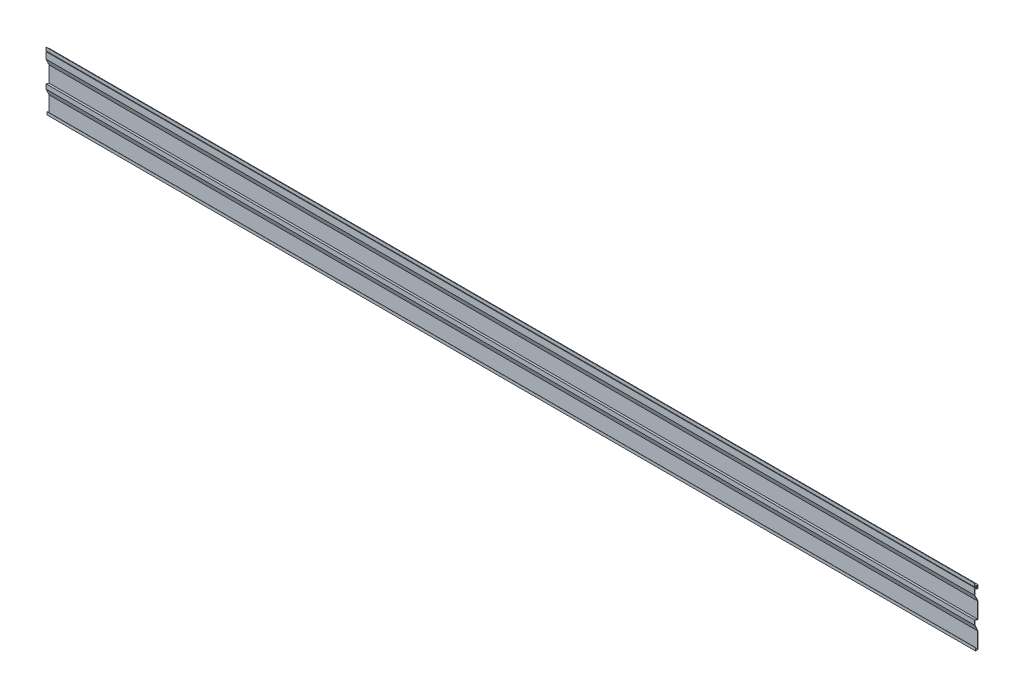
ISO-10303-21;
HEADER;
FILE_DESCRIPTION(('STEP AP214'),'2;1');
FILE_NAME('part.step','',(''),(''),'','','');
FILE_SCHEMA(('AUTOMOTIVE_DESIGN { 1 0 10303 214 1 1 1 1 }'));
ENDSEC;
DATA;
#1=APPLICATION_CONTEXT('core data for automotive mechanical design processes');
#2=APPLICATION_PROTOCOL_DEFINITION('international standard','automotive_design',2000,#1);
#3=PRODUCT_CONTEXT('',#1,'mechanical');
#4=PRODUCT('Part','Part','',(#3));
#5=PRODUCT_RELATED_PRODUCT_CATEGORY('part','',(#4));
#6=PRODUCT_DEFINITION_FORMATION('','',#4);
#7=PRODUCT_DEFINITION_CONTEXT('part definition',#1,'design');
#8=PRODUCT_DEFINITION('design','',#6,#7);
#9=PRODUCT_DEFINITION_SHAPE('','',#8);
#10=(LENGTH_UNIT() NAMED_UNIT(*) SI_UNIT(.MILLI.,.METRE.));
#11=(NAMED_UNIT(*) PLANE_ANGLE_UNIT() SI_UNIT($,.RADIAN.));
#12=(NAMED_UNIT(*) SI_UNIT($,.STERADIAN.) SOLID_ANGLE_UNIT());
#13=UNCERTAINTY_MEASURE_WITH_UNIT(LENGTH_MEASURE(1.E-05),#10,'distance_accuracy_value','');
#14=(GEOMETRIC_REPRESENTATION_CONTEXT(3) GLOBAL_UNCERTAINTY_ASSIGNED_CONTEXT((#13)) GLOBAL_UNIT_ASSIGNED_CONTEXT((#10,
#11,#12)) REPRESENTATION_CONTEXT('',''));
#15=CARTESIAN_POINT('',(0.,0.,0.));
#16=DIRECTION('',(0.,0.,1.));
#17=DIRECTION('',(1.,0.,0.));
#18=AXIS2_PLACEMENT_3D('',#15,#16,#17);
#19=CARTESIAN_POINT('',(3660.,-176.742770169573,21.0404628300535));
#20=DIRECTION('',(0.,0.,-1.));
#21=DIRECTION('',(-1.,0.,0.));
#22=AXIS2_PLACEMENT_3D('',#19,#20,#21);
#23=PLANE('',#22);
#24=DIRECTION('',(0.,-1.,0.));
#25=VECTOR('',#24,1.);
#26=CARTESIAN_POINT('',(0.,-176.742770169573,21.0404628300535));
#27=LINE('',#26,#25);
#28=CARTESIAN_POINT('',(0.,-165.442275203157,21.0404628300535));
#29=VERTEX_POINT('',#28);
#30=CARTESIAN_POINT('',(0.,-176.742770169573,21.0404628300535));
#31=VERTEX_POINT('',#30);
#32=EDGE_CURVE('E278',#29,#31,#27,.T.);
#33=ORIENTED_EDGE('',*,*,#32,.T.);
#34=DIRECTION('',(-1.,0.,0.));
#35=VECTOR('',#34,1.);
#36=CARTESIAN_POINT('',(3660.,-176.742770169573,21.0404628300535));
#37=LINE('',#36,#35);
#38=CARTESIAN_POINT('',(3660.,-176.742770169573,21.0404628300535));
#39=VERTEX_POINT('',#38);
#40=EDGE_CURVE('E11',#39,#31,#37,.T.);
#41=ORIENTED_EDGE('',*,*,#40,.F.);
#42=DIRECTION('',(0.,-1.,0.));
#43=VECTOR('',#42,1.);
#44=CARTESIAN_POINT('',(3660.,-176.742770169573,21.0404628300535));
#45=LINE('',#44,#43);
#46=CARTESIAN_POINT('',(3660.,-165.442275203157,21.0404628300535));
#47=VERTEX_POINT('',#46);
#48=EDGE_CURVE('E340',#47,#39,#45,.T.);
#49=ORIENTED_EDGE('',*,*,#48,.F.);
#50=DIRECTION('',(-1.,0.,0.));
#51=VECTOR('',#50,1.);
#52=CARTESIAN_POINT('',(3660.,-165.442275203157,21.0404628300535));
#53=LINE('',#52,#51);
#54=EDGE_CURVE('E274',#47,#29,#53,.T.);
#55=ORIENTED_EDGE('',*,*,#54,.T.);
#56=EDGE_LOOP('',(#33,#41,#49,#55));
#57=FACE_BOUND('',#56,.T.);
#58=ADVANCED_FACE('F38',(#57),#23,.F.);
#59=CARTESIAN_POINT('',(3660.,-176.742770169573,21.0404628300535));
#60=DIRECTION('',(0.,1.,0.));
#61=DIRECTION('',(0.,0.,1.));
#62=AXIS2_PLACEMENT_3D('',#59,#60,#61);
#63=PLANE('',#62);
#64=DIRECTION('',(0.,0.,-1.));
#65=VECTOR('',#64,1.);
#66=CARTESIAN_POINT('',(0.,-176.742770169573,21.0404628300535));
#67=LINE('',#66,#65);
#68=CARTESIAN_POINT('',(0.,-176.742770169573,11.0404628300535));
#69=VERTEX_POINT('',#68);
#70=EDGE_CURVE('E281',#31,#69,#67,.T.);
#71=ORIENTED_EDGE('',*,*,#70,.T.);
#72=DIRECTION('',(-1.,0.,0.));
#73=VECTOR('',#72,1.);
#74=CARTESIAN_POINT('',(3660.,-176.742770169573,11.0404628300535));
#75=LINE('',#74,#73);
#76=CARTESIAN_POINT('',(3660.,-176.742770169573,11.0404628300535));
#77=VERTEX_POINT('',#76);
#78=EDGE_CURVE('E46',#77,#69,#75,.T.);
#79=ORIENTED_EDGE('',*,*,#78,.F.);
#80=DIRECTION('',(0.,0.,-1.));
#81=VECTOR('',#80,1.);
#82=CARTESIAN_POINT('',(3660.,-176.742770169573,21.0404628300535));
#83=LINE('',#82,#81);
#84=EDGE_CURVE('E169',#39,#77,#83,.T.);
#85=ORIENTED_EDGE('',*,*,#84,.F.);
#86=ORIENTED_EDGE('',*,*,#40,.T.);
#87=EDGE_LOOP('',(#71,#79,#85,#86));
#88=FACE_BOUND('',#87,.T.);
#89=ADVANCED_FACE('F518',(#88),#63,.F.);
#90=CARTESIAN_POINT('',(3660.,-176.742770169573,11.0404628300535));
#91=DIRECTION('',(0.,0.,1.));
#92=DIRECTION('',(1.,0.,0.));
#93=AXIS2_PLACEMENT_3D('',#90,#91,#92);
#94=PLANE('',#93);
#95=DIRECTION('',(0.,1.,0.));
#96=VECTOR('',#95,1.);
#97=CARTESIAN_POINT('',(0.,-176.742770169573,11.0404628300535));
#98=LINE('',#97,#96);
#99=CARTESIAN_POINT('',(0.,-112.742770169573,11.0404628300535));
#100=VERTEX_POINT('',#99);
#101=EDGE_CURVE('E283',#69,#100,#98,.T.);
#102=ORIENTED_EDGE('',*,*,#101,.T.);
#103=DIRECTION('',(-1.,0.,0.));
#104=VECTOR('',#103,1.);
#105=CARTESIAN_POINT('',(3660.,-112.742770169573,11.0404628300535));
#106=LINE('',#105,#104);
#107=CARTESIAN_POINT('',(3660.,-112.742770169573,11.0404628300535));
#108=VERTEX_POINT('',#107);
#109=EDGE_CURVE('E419',#108,#100,#106,.T.);
#110=ORIENTED_EDGE('',*,*,#109,.F.);
#111=DIRECTION('',(0.,1.,0.));
#112=VECTOR('',#111,1.);
#113=CARTESIAN_POINT('',(3660.,-176.742770169573,11.0404628300535));
#114=LINE('',#113,#112);
#115=EDGE_CURVE('E427',#77,#108,#114,.T.);
#116=ORIENTED_EDGE('',*,*,#115,.F.);
#117=ORIENTED_EDGE('',*,*,#78,.T.);
#118=EDGE_LOOP('',(#102,#110,#116,#117));
#119=FACE_BOUND('',#118,.T.);
#120=ADVANCED_FACE('F425',(#119),#94,.F.);
#121=CARTESIAN_POINT('',(3660.,-112.742770169573,11.0404628300535));
#122=DIRECTION('',(0.,-0.430724047871383,0.902483681063148));
#123=DIRECTION('',(0.,-0.902483681063148,-0.430724047871383));
#124=AXIS2_PLACEMENT_3D('',#121,#122,#123);
#125=PLANE('',#124);
#126=DIRECTION('',(0.,0.902483681063148,0.430724047871383));
#127=VECTOR('',#126,1.);
#128=CARTESIAN_POINT('',(0.,-112.742770169573,11.0404628300535));
#129=LINE('',#128,#127);
#130=CARTESIAN_POINT('',(0.,-86.7468857968479,23.4473935923095));
#131=VERTEX_POINT('',#130);
#132=EDGE_CURVE('E285',#100,#131,#129,.T.);
#133=ORIENTED_EDGE('',*,*,#132,.T.);
#134=DIRECTION('',(-1.,0.,0.));
#135=VECTOR('',#134,1.);
#136=CARTESIAN_POINT('',(3660.,-86.7468857968479,23.4473935923095));
#137=LINE('',#136,#135);
#138=CARTESIAN_POINT('',(3660.,-86.7468857968479,23.4473935923095));
#139=VERTEX_POINT('',#138);
#140=EDGE_CURVE('E416',#139,#131,#137,.T.);
#141=ORIENTED_EDGE('',*,*,#140,.F.);
#142=DIRECTION('',(0.,0.902483681063148,0.430724047871383));
#143=VECTOR('',#142,1.);
#144=CARTESIAN_POINT('',(3660.,-112.742770169573,11.0404628300535));
#145=LINE('',#144,#143);
#146=EDGE_CURVE('E445',#108,#139,#145,.T.);
#147=ORIENTED_EDGE('',*,*,#146,.F.);
#148=ORIENTED_EDGE('',*,*,#109,.T.);
#149=EDGE_LOOP('',(#133,#141,#147,#148));
#150=FACE_BOUND('',#149,.T.);
#151=ADVANCED_FACE('F436',(#150),#125,.F.);
#152=CARTESIAN_POINT('',(3660.,-86.7468857968479,23.4473935923095));
#153=DIRECTION('',(0.,0.,1.));
#154=DIRECTION('',(1.,0.,0.));
#155=AXIS2_PLACEMENT_3D('',#152,#153,#154);
#156=PLANE('',#155);
#157=DIRECTION('',(0.,1.,0.));
#158=VECTOR('',#157,1.);
#159=CARTESIAN_POINT('',(0.,-86.7468857968479,23.4473935923095));
#160=LINE('',#159,#158);
#161=CARTESIAN_POINT('',(0.,-71.1496014100118,23.4473935923095));
#162=VERTEX_POINT('',#161);
#163=EDGE_CURVE('E287',#131,#162,#160,.T.);
#164=ORIENTED_EDGE('',*,*,#163,.T.);
#165=DIRECTION('',(-1.,0.,0.));
#166=VECTOR('',#165,1.);
#167=CARTESIAN_POINT('',(3660.,-71.1496014100118,23.4473935923095));
#168=LINE('',#167,#166);
#169=CARTESIAN_POINT('',(3660.,-71.1496014100118,23.4473935923095));
#170=VERTEX_POINT('',#169);
#171=EDGE_CURVE('E413',#170,#162,#168,.T.);
#172=ORIENTED_EDGE('',*,*,#171,.F.);
#173=DIRECTION('',(0.,1.,0.));
#174=VECTOR('',#173,1.);
#175=CARTESIAN_POINT('',(3660.,-86.7468857968479,23.4473935923095));
#176=LINE('',#175,#174);
#177=EDGE_CURVE('E442',#139,#170,#176,.T.);
#178=ORIENTED_EDGE('',*,*,#177,.F.);
#179=ORIENTED_EDGE('',*,*,#140,.T.);
#180=EDGE_LOOP('',(#164,#172,#178,#179));
#181=FACE_BOUND('',#180,.T.);
#182=ADVANCED_FACE('F440',(#181),#156,.F.);
#183=CARTESIAN_POINT('',(3660.,-71.1496014100118,23.4473935923095));
#184=DIRECTION('',(0.,0.961523947640823,-0.274721127897377));
#185=DIRECTION('',(0.,0.274721127897377,0.961523947640823));
#186=AXIS2_PLACEMENT_3D('',#183,#184,#185);
#187=PLANE('',#186);
#188=DIRECTION('',(0.,-0.274721127897377,-0.961523947640823));
#189=VECTOR('',#188,1.);
#190=CARTESIAN_POINT('',(0.,-71.1496014100118,23.4473935923095));
#191=LINE('',#190,#189);
#192=CARTESIAN_POINT('',(0.,-74.6944387706563,11.0404628300535));
#193=VERTEX_POINT('',#192);
#194=EDGE_CURVE('E289',#162,#193,#191,.T.);
#195=ORIENTED_EDGE('',*,*,#194,.T.);
#196=DIRECTION('',(-1.,0.,0.));
#197=VECTOR('',#196,1.);
#198=CARTESIAN_POINT('',(3660.,-74.6944387706563,11.0404628300535));
#199=LINE('',#198,#197);
#200=CARTESIAN_POINT('',(3660.,-74.6944387706563,11.0404628300535));
#201=VERTEX_POINT('',#200);
#202=EDGE_CURVE('E410',#201,#193,#199,.T.);
#203=ORIENTED_EDGE('',*,*,#202,.F.);
#204=DIRECTION('',(0.,-0.274721127897377,-0.961523947640823));
#205=VECTOR('',#204,1.);
#206=CARTESIAN_POINT('',(3660.,-71.1496014100118,23.4473935923095));
#207=LINE('',#206,#205);
#208=EDGE_CURVE('E444',#170,#201,#207,.T.);
#209=ORIENTED_EDGE('',*,*,#208,.F.);
#210=ORIENTED_EDGE('',*,*,#171,.T.);
#211=EDGE_LOOP('',(#195,#203,#209,#210));
#212=FACE_BOUND('',#211,.T.);
#213=ADVANCED_FACE('F531',(#212),#187,.F.);
#214=CARTESIAN_POINT('',(3660.,-74.6944387706563,11.0404628300535));
#215=DIRECTION('',(0.,0.,1.));
#216=DIRECTION('',(1.,0.,0.));
#217=AXIS2_PLACEMENT_3D('',#214,#215,#216);
#218=PLANE('',#217);
#219=DIRECTION('',(0.,1.,0.));
#220=VECTOR('',#219,1.);
#221=CARTESIAN_POINT('',(0.,-74.6944387706563,11.0404628300535));
#222=LINE('',#221,#220);
#223=CARTESIAN_POINT('',(0.,-10.6944387706563,11.0404628300535));
#224=VERTEX_POINT('',#223);
#225=EDGE_CURVE('E291',#193,#224,#222,.T.);
#226=ORIENTED_EDGE('',*,*,#225,.T.);
#227=DIRECTION('',(-1.,0.,0.));
#228=VECTOR('',#227,1.);
#229=CARTESIAN_POINT('',(3660.,-10.6944387706563,11.0404628300535));
#230=LINE('',#229,#228);
#231=CARTESIAN_POINT('',(3660.,-10.6944387706563,11.0404628300535));
#232=VERTEX_POINT('',#231);
#233=EDGE_CURVE('E407',#232,#224,#230,.T.);
#234=ORIENTED_EDGE('',*,*,#233,.F.);
#235=DIRECTION('',(0.,1.,0.));
#236=VECTOR('',#235,1.);
#237=CARTESIAN_POINT('',(3660.,-74.6944387706563,11.0404628300535));
#238=LINE('',#237,#236);
#239=EDGE_CURVE('E447',#201,#232,#238,.T.);
#240=ORIENTED_EDGE('',*,*,#239,.F.);
#241=ORIENTED_EDGE('',*,*,#202,.T.);
#242=EDGE_LOOP('',(#226,#234,#240,#241));
#243=FACE_BOUND('',#242,.T.);
#244=ADVANCED_FACE('F534',(#243),#218,.F.);
#245=CARTESIAN_POINT('',(3660.,-10.6944387706563,11.0404628300535));
#246=DIRECTION('',(0.,-0.430724047871383,0.902483681063148));
#247=DIRECTION('',(0.,-0.902483681063148,-0.430724047871384));
#248=AXIS2_PLACEMENT_3D('',#245,#246,#247);
#249=PLANE('',#248);
#250=DIRECTION('',(0.,0.902483681063148,0.430724047871383));
#251=VECTOR('',#250,1.);
#252=CARTESIAN_POINT('',(0.,-10.6944387706563,11.0404628300535));
#253=LINE('',#252,#251);
#254=CARTESIAN_POINT('',(0.,15.3014456020684,23.4473935923095));
#255=VERTEX_POINT('',#254);
#256=EDGE_CURVE('E293',#224,#255,#253,.T.);
#257=ORIENTED_EDGE('',*,*,#256,.T.);
#258=DIRECTION('',(-1.,0.,0.));
#259=VECTOR('',#258,1.);
#260=CARTESIAN_POINT('',(3660.,15.3014456020684,23.4473935923095));
#261=LINE('',#260,#259);
#262=CARTESIAN_POINT('',(3660.,15.3014456020684,23.4473935923095));
#263=VERTEX_POINT('',#262);
#264=EDGE_CURVE('E404',#263,#255,#261,.T.);
#265=ORIENTED_EDGE('',*,*,#264,.F.);
#266=DIRECTION('',(0.,0.902483681063148,0.430724047871383));
#267=VECTOR('',#266,1.);
#268=CARTESIAN_POINT('',(3660.,-10.6944387706563,11.0404628300535));
#269=LINE('',#268,#267);
#270=EDGE_CURVE('E453',#232,#263,#269,.T.);
#271=ORIENTED_EDGE('',*,*,#270,.F.);
#272=ORIENTED_EDGE('',*,*,#233,.T.);
#273=EDGE_LOOP('',(#257,#265,#271,#272));
#274=FACE_BOUND('',#273,.T.);
#275=ADVANCED_FACE('F538',(#274),#249,.F.);
#276=CARTESIAN_POINT('',(3660.,15.3014456020684,23.4473935923095));
#277=DIRECTION('',(0.,0.,1.));
#278=DIRECTION('',(1.,0.,0.));
#279=AXIS2_PLACEMENT_3D('',#276,#277,#278);
#280=PLANE('',#279);
#281=DIRECTION('',(0.,1.,0.));
#282=VECTOR('',#281,1.);
#283=CARTESIAN_POINT('',(0.,15.3014456020684,23.4473935923095));
#284=LINE('',#283,#282);
#285=CARTESIAN_POINT('',(0.,40.3055612293437,23.4473935923095));
#286=VERTEX_POINT('',#285);
#287=EDGE_CURVE('E295',#255,#286,#284,.T.);
#288=ORIENTED_EDGE('',*,*,#287,.T.);
#289=DIRECTION('',(-1.,0.,0.));
#290=VECTOR('',#289,1.);
#291=CARTESIAN_POINT('',(3660.,40.3055612293437,23.4473935923095));
#292=LINE('',#291,#290);
#293=CARTESIAN_POINT('',(3660.,40.3055612293437,23.4473935923095));
#294=VERTEX_POINT('',#293);
#295=EDGE_CURVE('E401',#294,#286,#292,.T.);
#296=ORIENTED_EDGE('',*,*,#295,.F.);
#297=DIRECTION('',(0.,1.,0.));
#298=VECTOR('',#297,1.);
#299=CARTESIAN_POINT('',(3660.,15.3014456020684,23.4473935923095));
#300=LINE('',#299,#298);
#301=EDGE_CURVE('E455',#263,#294,#300,.T.);
#302=ORIENTED_EDGE('',*,*,#301,.F.);
#303=ORIENTED_EDGE('',*,*,#264,.T.);
#304=EDGE_LOOP('',(#288,#296,#302,#303));
#305=FACE_BOUND('',#304,.T.);
#306=ADVANCED_FACE('F542',(#305),#280,.F.);
#307=CARTESIAN_POINT('',(3660.,40.3055612293437,23.4473935923095));
#308=DIRECTION('',(0.,1.,0.));
#309=DIRECTION('',(0.,0.,1.));
#310=AXIS2_PLACEMENT_3D('',#307,#308,#309);
#311=PLANE('',#310);
#312=DIRECTION('',(0.,0.,-1.));
#313=VECTOR('',#312,1.);
#314=CARTESIAN_POINT('',(0.,40.3055612293437,23.4473935923095));
#315=LINE('',#314,#313);
#316=CARTESIAN_POINT('',(0.,40.3055612293437,17.2439282111815));
#317=VERTEX_POINT('',#316);
#318=EDGE_CURVE('E297',#286,#317,#315,.T.);
#319=ORIENTED_EDGE('',*,*,#318,.T.);
#320=DIRECTION('',(-1.,0.,0.));
#321=VECTOR('',#320,1.);
#322=CARTESIAN_POINT('',(3660.,40.3055612293437,17.2439282111815));
#323=LINE('',#322,#321);
#324=CARTESIAN_POINT('',(3660.,40.3055612293437,17.2439282111815));
#325=VERTEX_POINT('',#324);
#326=EDGE_CURVE('E398',#325,#317,#323,.T.);
#327=ORIENTED_EDGE('',*,*,#326,.F.);
#328=DIRECTION('',(0.,0.,-1.));
#329=VECTOR('',#328,1.);
#330=CARTESIAN_POINT('',(3660.,40.3055612293437,23.4473935923095));
#331=LINE('',#330,#329);
#332=EDGE_CURVE('E457',#294,#325,#331,.T.);
#333=ORIENTED_EDGE('',*,*,#332,.F.);
#334=ORIENTED_EDGE('',*,*,#295,.T.);
#335=EDGE_LOOP('',(#319,#327,#333,#334));
#336=FACE_BOUND('',#335,.T.);
#337=ADVANCED_FACE('F546',(#336),#311,.F.);
#338=CARTESIAN_POINT('',(3660.,40.3055612293437,17.2439282111815));
#339=DIRECTION('',(0.,0.,-1.));
#340=DIRECTION('',(-1.,0.,0.));
#341=AXIS2_PLACEMENT_3D('',#338,#339,#340);
#342=PLANE('',#341);
#343=DIRECTION('',(0.,-1.,0.));
#344=VECTOR('',#343,1.);
#345=CARTESIAN_POINT('',(0.,40.3055612293437,17.2439282111815));
#346=LINE('',#345,#344);
#347=CARTESIAN_POINT('',(0.,32.0051657847453,17.2439282111815));
#348=VERTEX_POINT('',#347);
#349=EDGE_CURVE('E299',#317,#348,#346,.T.);
#350=ORIENTED_EDGE('',*,*,#349,.T.);
#351=DIRECTION('',(-1.,0.,0.));
#352=VECTOR('',#351,1.);
#353=CARTESIAN_POINT('',(3660.,32.0051657847453,17.2439282111815));
#354=LINE('',#353,#352);
#355=CARTESIAN_POINT('',(3660.,32.0051657847453,17.2439282111815));
#356=VERTEX_POINT('',#355);
#357=EDGE_CURVE('E395',#356,#348,#354,.T.);
#358=ORIENTED_EDGE('',*,*,#357,.F.);
#359=DIRECTION('',(0.,-1.,0.));
#360=VECTOR('',#359,1.);
#361=CARTESIAN_POINT('',(3660.,40.3055612293437,17.2439282111815));
#362=LINE('',#361,#360);
#363=EDGE_CURVE('E459',#325,#356,#362,.T.);
#364=ORIENTED_EDGE('',*,*,#363,.F.);
#365=ORIENTED_EDGE('',*,*,#326,.T.);
#366=EDGE_LOOP('',(#350,#358,#364,#365));
#367=FACE_BOUND('',#366,.T.);
#368=ADVANCED_FACE('F550',(#367),#342,.F.);
#369=CARTESIAN_POINT('',(3660.,32.0051657847453,17.2439282111815));
#370=DIRECTION('',(0.,1.,0.));
#371=DIRECTION('',(0.,0.,1.));
#372=AXIS2_PLACEMENT_3D('',#369,#370,#371);
#373=PLANE('',#372);
#374=DIRECTION('',(0.,0.,-1.));
#375=VECTOR('',#374,1.);
#376=CARTESIAN_POINT('',(0.,32.0051657847453,17.2439282111815));
#377=LINE('',#376,#375);
#378=CARTESIAN_POINT('',(0.,32.0051657847453,11.0404628300535));
#379=VERTEX_POINT('',#378);
#380=EDGE_CURVE('E301',#348,#379,#377,.T.);
#381=ORIENTED_EDGE('',*,*,#380,.T.);
#382=DIRECTION('',(-1.,0.,0.));
#383=VECTOR('',#382,1.);
#384=CARTESIAN_POINT('',(3660.,32.0051657847453,11.0404628300535));
#385=LINE('',#384,#383);
#386=CARTESIAN_POINT('',(3660.,32.0051657847453,11.0404628300535));
#387=VERTEX_POINT('',#386);
#388=EDGE_CURVE('E392',#387,#379,#385,.T.);
#389=ORIENTED_EDGE('',*,*,#388,.F.);
#390=DIRECTION('',(0.,0.,-1.));
#391=VECTOR('',#390,1.);
#392=CARTESIAN_POINT('',(3660.,32.0051657847453,17.2439282111815));
#393=LINE('',#392,#391);
#394=EDGE_CURVE('E461',#356,#387,#393,.T.);
#395=ORIENTED_EDGE('',*,*,#394,.F.);
#396=ORIENTED_EDGE('',*,*,#357,.T.);
#397=EDGE_LOOP('',(#381,#389,#395,#396));
#398=FACE_BOUND('',#397,.T.);
#399=ADVANCED_FACE('F554',(#398),#373,.F.);
#400=CARTESIAN_POINT('',(3660.,32.0051657847453,11.0404628300535));
#401=DIRECTION('',(0.,0.,1.));
#402=DIRECTION('',(1.,0.,0.));
#403=AXIS2_PLACEMENT_3D('',#400,#401,#402);
#404=PLANE('',#403);
#405=DIRECTION('',(0.,1.,0.));
#406=VECTOR('',#405,1.);
#407=CARTESIAN_POINT('',(0.,32.0051657847453,11.0404628300535));
#408=LINE('',#407,#406);
#409=CARTESIAN_POINT('',(0.,45.1210640191303,11.0404628300535));
#410=VERTEX_POINT('',#409);
#411=EDGE_CURVE('E303',#379,#410,#408,.T.);
#412=ORIENTED_EDGE('',*,*,#411,.T.);
#413=DIRECTION('',(-1.,0.,0.));
#414=VECTOR('',#413,1.);
#415=CARTESIAN_POINT('',(3660.,45.1210640191303,11.0404628300535));
#416=LINE('',#415,#414);
#417=CARTESIAN_POINT('',(3660.,45.1210640191303,11.0404628300535));
#418=VERTEX_POINT('',#417);
#419=EDGE_CURVE('E389',#418,#410,#416,.T.);
#420=ORIENTED_EDGE('',*,*,#419,.F.);
#421=DIRECTION('',(0.,1.,0.));
#422=VECTOR('',#421,1.);
#423=CARTESIAN_POINT('',(3660.,32.0051657847453,11.0404628300535));
#424=LINE('',#423,#422);
#425=EDGE_CURVE('E463',#387,#418,#424,.T.);
#426=ORIENTED_EDGE('',*,*,#425,.F.);
#427=ORIENTED_EDGE('',*,*,#388,.T.);
#428=EDGE_LOOP('',(#412,#420,#426,#427));
#429=FACE_BOUND('',#428,.T.);
#430=ADVANCED_FACE('F558',(#429),#404,.F.);
#431=CARTESIAN_POINT('',(3660.,45.1210640191303,11.0404628300535));
#432=DIRECTION('',(0.,-1.,0.));
#433=DIRECTION('',(0.,0.,-1.));
#434=AXIS2_PLACEMENT_3D('',#431,#432,#433);
#435=PLANE('',#434);
#436=DIRECTION('',(0.,0.,1.));
#437=VECTOR('',#436,1.);
#438=CARTESIAN_POINT('',(0.,45.1210640191303,11.0404628300535));
#439=LINE('',#438,#437);
#440=CARTESIAN_POINT('',(0.,45.1210640191303,23.4473935923095));
#441=VERTEX_POINT('',#440);
#442=EDGE_CURVE('E305',#410,#441,#439,.T.);
#443=ORIENTED_EDGE('',*,*,#442,.T.);
#444=DIRECTION('',(-1.,0.,0.));
#445=VECTOR('',#444,1.);
#446=CARTESIAN_POINT('',(3660.,45.1210640191303,23.4473935923095));
#447=LINE('',#446,#445);
#448=CARTESIAN_POINT('',(3660.,45.1210640191303,23.4473935923095));
#449=VERTEX_POINT('',#448);
#450=EDGE_CURVE('E386',#449,#441,#447,.T.);
#451=ORIENTED_EDGE('',*,*,#450,.F.);
#452=DIRECTION('',(0.,0.,1.));
#453=VECTOR('',#452,1.);
#454=CARTESIAN_POINT('',(3660.,45.1210640191303,11.0404628300535));
#455=LINE('',#454,#453);
#456=EDGE_CURVE('E465',#418,#449,#455,.T.);
#457=ORIENTED_EDGE('',*,*,#456,.F.);
#458=ORIENTED_EDGE('',*,*,#419,.T.);
#459=EDGE_LOOP('',(#443,#451,#457,#458));
#460=FACE_BOUND('',#459,.T.);
#461=ADVANCED_FACE('F562',(#460),#435,.F.);
#462=CARTESIAN_POINT('',(3660.,45.1210640191303,23.4473935923095));
#463=DIRECTION('',(0.,0.,1.));
#464=DIRECTION('',(1.,0.,0.));
#465=AXIS2_PLACEMENT_3D('',#462,#463,#464);
#466=PLANE('',#465);
#467=DIRECTION('',(0.,1.,0.));
#468=VECTOR('',#467,1.);
#469=CARTESIAN_POINT('',(0.,45.1210640191303,23.4473935923095));
#470=LINE('',#469,#468);
#471=CARTESIAN_POINT('',(0.,56.3055612293437,23.4473935923095));
#472=VERTEX_POINT('',#471);
#473=EDGE_CURVE('E307',#441,#472,#470,.T.);
#474=ORIENTED_EDGE('',*,*,#473,.T.);
#475=DIRECTION('',(-1.,0.,0.));
#476=VECTOR('',#475,1.);
#477=CARTESIAN_POINT('',(3660.,56.3055612293437,23.4473935923095));
#478=LINE('',#477,#476);
#479=CARTESIAN_POINT('',(3660.,56.3055612293437,23.4473935923095));
#480=VERTEX_POINT('',#479);
#481=EDGE_CURVE('E383',#480,#472,#478,.T.);
#482=ORIENTED_EDGE('',*,*,#481,.F.);
#483=DIRECTION('',(0.,1.,0.));
#484=VECTOR('',#483,1.);
#485=CARTESIAN_POINT('',(3660.,45.1210640191303,23.4473935923095));
#486=LINE('',#485,#484);
#487=EDGE_CURVE('E467',#449,#480,#486,.T.);
#488=ORIENTED_EDGE('',*,*,#487,.F.);
#489=ORIENTED_EDGE('',*,*,#450,.T.);
#490=EDGE_LOOP('',(#474,#482,#488,#489));
#491=FACE_BOUND('',#490,.T.);
#492=ADVANCED_FACE('F566',(#491),#466,.F.);
#493=CARTESIAN_POINT('',(3660.,56.3055612293437,24.5071196606439));
#494=DIRECTION('',(0.,-1.,0.));
#495=DIRECTION('',(0.,0.,-1.));
#496=AXIS2_PLACEMENT_3D('',#493,#494,#495);
#497=PLANE('',#496);
#498=DIRECTION('',(0.,0.,1.));
#499=VECTOR('',#498,1.);
#500=CARTESIAN_POINT('',(0.,56.3055612293437,24.5071196606439));
#501=LINE('',#500,#499);
#502=CARTESIAN_POINT('',(0.,56.3055612293437,24.5071196606439));
#503=VERTEX_POINT('',#502);
#504=EDGE_CURVE('E309',#472,#503,#501,.T.);
#505=ORIENTED_EDGE('',*,*,#504,.T.);
#506=DIRECTION('',(-1.,0.,0.));
#507=VECTOR('',#506,1.);
#508=CARTESIAN_POINT('',(3660.,56.3055612293437,24.5071196606439));
#509=LINE('',#508,#507);
#510=CARTESIAN_POINT('',(3660.,56.3055612293437,24.5071196606439));
#511=VERTEX_POINT('',#510);
#512=EDGE_CURVE('E380',#511,#503,#509,.T.);
#513=ORIENTED_EDGE('',*,*,#512,.F.);
#514=DIRECTION('',(0.,0.,1.));
#515=VECTOR('',#514,1.);
#516=CARTESIAN_POINT('',(3660.,56.3055612293437,24.5071196606439));
#517=LINE('',#516,#515);
#518=EDGE_CURVE('E469',#480,#511,#517,.T.);
#519=ORIENTED_EDGE('',*,*,#518,.F.);
#520=ORIENTED_EDGE('',*,*,#481,.T.);
#521=EDGE_LOOP('',(#505,#513,#519,#520));
#522=FACE_BOUND('',#521,.T.);
#523=ADVANCED_FACE('F570',(#522),#497,.F.);
#524=CARTESIAN_POINT('',(3660.,43.8204378839902,24.5071196606439));
#525=DIRECTION('',(0.,0.,-1.));
#526=DIRECTION('',(-1.,0.,0.));
#527=AXIS2_PLACEMENT_3D('',#524,#525,#526);
#528=PLANE('',#527);
#529=DIRECTION('',(0.,-1.,0.));
#530=VECTOR('',#529,1.);
#531=CARTESIAN_POINT('',(0.,43.8204378839902,24.5071196606439));
#532=LINE('',#531,#530);
#533=CARTESIAN_POINT('',(0.,43.8204378839902,24.5071196606439));
#534=VERTEX_POINT('',#533);
#535=EDGE_CURVE('E311',#503,#534,#532,.T.);
#536=ORIENTED_EDGE('',*,*,#535,.T.);
#537=DIRECTION('',(-1.,0.,0.));
#538=VECTOR('',#537,1.);
#539=CARTESIAN_POINT('',(3660.,43.8204378839902,24.5071196606439));
#540=LINE('',#539,#538);
#541=CARTESIAN_POINT('',(3660.,43.8204378839902,24.5071196606439));
#542=VERTEX_POINT('',#541);
#543=EDGE_CURVE('E377',#542,#534,#540,.T.);
#544=ORIENTED_EDGE('',*,*,#543,.F.);
#545=DIRECTION('',(0.,-1.,0.));
#546=VECTOR('',#545,1.);
#547=CARTESIAN_POINT('',(3660.,43.8204378839902,24.5071196606439));
#548=LINE('',#547,#546);
#549=EDGE_CURVE('E471',#511,#542,#548,.T.);
#550=ORIENTED_EDGE('',*,*,#549,.F.);
#551=ORIENTED_EDGE('',*,*,#512,.T.);
#552=EDGE_LOOP('',(#536,#544,#550,#551));
#553=FACE_BOUND('',#552,.T.);
#554=ADVANCED_FACE('F574',(#553),#528,.F.);
#555=CARTESIAN_POINT('',(3660.,43.8204378839902,12.1001888983879));
#556=DIRECTION('',(0.,1.,0.));
#557=DIRECTION('',(0.,0.,1.));
#558=AXIS2_PLACEMENT_3D('',#555,#556,#557);
#559=PLANE('',#558);
#560=DIRECTION('',(0.,0.,-1.));
#561=VECTOR('',#560,1.);
#562=CARTESIAN_POINT('',(0.,43.8204378839902,12.1001888983879));
#563=LINE('',#562,#561);
#564=CARTESIAN_POINT('',(0.,43.8204378839902,12.1001888983879));
#565=VERTEX_POINT('',#564);
#566=EDGE_CURVE('E313',#534,#565,#563,.T.);
#567=ORIENTED_EDGE('',*,*,#566,.T.);
#568=DIRECTION('',(-1.,0.,0.));
#569=VECTOR('',#568,1.);
#570=CARTESIAN_POINT('',(3660.,43.8204378839902,12.1001888983879));
#571=LINE('',#570,#569);
#572=CARTESIAN_POINT('',(3660.,43.8204378839902,12.1001888983879));
#573=VERTEX_POINT('',#572);
#574=EDGE_CURVE('E374',#573,#565,#571,.T.);
#575=ORIENTED_EDGE('',*,*,#574,.F.);
#576=DIRECTION('',(0.,0.,-1.));
#577=VECTOR('',#576,1.);
#578=CARTESIAN_POINT('',(3660.,43.8204378839902,12.1001888983879));
#579=LINE('',#578,#577);
#580=EDGE_CURVE('E473',#542,#573,#579,.T.);
#581=ORIENTED_EDGE('',*,*,#580,.F.);
#582=ORIENTED_EDGE('',*,*,#543,.T.);
#583=EDGE_LOOP('',(#567,#575,#581,#582));
#584=FACE_BOUND('',#583,.T.);
#585=ADVANCED_FACE('F578',(#584),#559,.F.);
#586=CARTESIAN_POINT('',(3660.,33.361087921631,12.1001888983879));
#587=DIRECTION('',(0.,0.,-1.));
#588=DIRECTION('',(-1.,0.,0.));
#589=AXIS2_PLACEMENT_3D('',#586,#587,#588);
#590=PLANE('',#589);
#591=DIRECTION('',(0.,-1.,0.));
#592=VECTOR('',#591,1.);
#593=CARTESIAN_POINT('',(0.,33.361087921631,12.1001888983879));
#594=LINE('',#593,#592);
#595=CARTESIAN_POINT('',(0.,33.361087921631,12.1001888983879));
#596=VERTEX_POINT('',#595);
#597=EDGE_CURVE('E315',#565,#596,#594,.T.);
#598=ORIENTED_EDGE('',*,*,#597,.T.);
#599=DIRECTION('',(-1.,0.,0.));
#600=VECTOR('',#599,1.);
#601=CARTESIAN_POINT('',(3660.,33.361087921631,12.1001888983879));
#602=LINE('',#601,#600);
#603=CARTESIAN_POINT('',(3660.,33.361087921631,12.1001888983879));
#604=VERTEX_POINT('',#603);
#605=EDGE_CURVE('E371',#604,#596,#602,.T.);
#606=ORIENTED_EDGE('',*,*,#605,.F.);
#607=DIRECTION('',(0.,-1.,0.));
#608=VECTOR('',#607,1.);
#609=CARTESIAN_POINT('',(3660.,33.361087921631,12.1001888983879));
#610=LINE('',#609,#608);
#611=EDGE_CURVE('E475',#573,#604,#610,.T.);
#612=ORIENTED_EDGE('',*,*,#611,.F.);
#613=ORIENTED_EDGE('',*,*,#574,.T.);
#614=EDGE_LOOP('',(#598,#606,#612,#613));
#615=FACE_BOUND('',#614,.T.);
#616=ADVANCED_FACE('F582',(#615),#590,.F.);
#617=CARTESIAN_POINT('',(3660.,33.361087921631,16.2229249000667));
#618=DIRECTION('',(0.,-1.,0.));
#619=DIRECTION('',(0.,0.,-1.));
#620=AXIS2_PLACEMENT_3D('',#617,#618,#619);
#621=PLANE('',#620);
#622=DIRECTION('',(0.,0.,1.));
#623=VECTOR('',#622,1.);
#624=CARTESIAN_POINT('',(0.,33.361087921631,16.2229249000667));
#625=LINE('',#624,#623);
#626=CARTESIAN_POINT('',(0.,33.361087921631,16.2229249000667));
#627=VERTEX_POINT('',#626);
#628=EDGE_CURVE('E317',#596,#627,#625,.T.);
#629=ORIENTED_EDGE('',*,*,#628,.T.);
#630=DIRECTION('',(-1.,0.,0.));
#631=VECTOR('',#630,1.);
#632=CARTESIAN_POINT('',(3660.,33.361087921631,16.2229249000667));
#633=LINE('',#632,#631);
#634=CARTESIAN_POINT('',(3660.,33.361087921631,16.2229249000667));
#635=VERTEX_POINT('',#634);
#636=EDGE_CURVE('E368',#635,#627,#633,.T.);
#637=ORIENTED_EDGE('',*,*,#636,.F.);
#638=DIRECTION('',(0.,0.,1.));
#639=VECTOR('',#638,1.);
#640=CARTESIAN_POINT('',(3660.,33.361087921631,16.2229249000667));
#641=LINE('',#640,#639);
#642=EDGE_CURVE('E477',#604,#635,#641,.T.);
#643=ORIENTED_EDGE('',*,*,#642,.F.);
#644=ORIENTED_EDGE('',*,*,#605,.T.);
#645=EDGE_LOOP('',(#629,#637,#643,#644));
#646=FACE_BOUND('',#645,.T.);
#647=ADVANCED_FACE('F586',(#646),#621,.F.);
#648=CARTESIAN_POINT('',(3660.,41.2325574809322,16.2229249000667));
#649=DIRECTION('',(0.,0.,1.));
#650=DIRECTION('',(1.,0.,0.));
#651=AXIS2_PLACEMENT_3D('',#648,#649,#650);
#652=PLANE('',#651);
#653=DIRECTION('',(0.,1.,0.));
#654=VECTOR('',#653,1.);
#655=CARTESIAN_POINT('',(0.,41.2325574809322,16.2229249000667));
#656=LINE('',#655,#654);
#657=CARTESIAN_POINT('',(0.,41.2325574809322,16.2229249000667));
#658=VERTEX_POINT('',#657);
#659=EDGE_CURVE('E319',#627,#658,#656,.T.);
#660=ORIENTED_EDGE('',*,*,#659,.T.);
#661=DIRECTION('',(-1.,0.,0.));
#662=VECTOR('',#661,1.);
#663=CARTESIAN_POINT('',(3660.,41.2325574809322,16.2229249000667));
#664=LINE('',#663,#662);
#665=CARTESIAN_POINT('',(3660.,41.2325574809322,16.2229249000667));
#666=VERTEX_POINT('',#665);
#667=EDGE_CURVE('E365',#666,#658,#664,.T.);
#668=ORIENTED_EDGE('',*,*,#667,.F.);
#669=DIRECTION('',(0.,1.,0.));
#670=VECTOR('',#669,1.);
#671=CARTESIAN_POINT('',(3660.,41.2325574809322,16.2229249000667));
#672=LINE('',#671,#670);
#673=EDGE_CURVE('E479',#635,#666,#672,.T.);
#674=ORIENTED_EDGE('',*,*,#673,.F.);
#675=ORIENTED_EDGE('',*,*,#636,.T.);
#676=EDGE_LOOP('',(#660,#668,#674,#675));
#677=FACE_BOUND('',#676,.T.);
#678=ADVANCED_FACE('F590',(#677),#652,.F.);
#679=CARTESIAN_POINT('',(3660.,41.2325574809322,24.5071196606439));
#680=DIRECTION('',(0.,-1.,0.));
#681=DIRECTION('',(0.,0.,-1.));
#682=AXIS2_PLACEMENT_3D('',#679,#680,#681);
#683=PLANE('',#682);
#684=DIRECTION('',(0.,0.,1.));
#685=VECTOR('',#684,1.);
#686=CARTESIAN_POINT('',(0.,41.2325574809322,24.5071196606439));
#687=LINE('',#686,#685);
#688=CARTESIAN_POINT('',(0.,41.2325574809322,24.5071196606439));
#689=VERTEX_POINT('',#688);
#690=EDGE_CURVE('E321',#658,#689,#687,.T.);
#691=ORIENTED_EDGE('',*,*,#690,.T.);
#692=DIRECTION('',(-1.,0.,0.));
#693=VECTOR('',#692,1.);
#694=CARTESIAN_POINT('',(3660.,41.2325574809322,24.5071196606439));
#695=LINE('',#694,#693);
#696=CARTESIAN_POINT('',(3660.,41.2325574809322,24.5071196606439));
#697=VERTEX_POINT('',#696);
#698=EDGE_CURVE('E362',#697,#689,#695,.T.);
#699=ORIENTED_EDGE('',*,*,#698,.F.);
#700=DIRECTION('',(0.,0.,1.));
#701=VECTOR('',#700,1.);
#702=CARTESIAN_POINT('',(3660.,41.2325574809322,24.5071196606439));
#703=LINE('',#702,#701);
#704=EDGE_CURVE('E481',#666,#697,#703,.T.);
#705=ORIENTED_EDGE('',*,*,#704,.F.);
#706=ORIENTED_EDGE('',*,*,#667,.T.);
#707=EDGE_LOOP('',(#691,#699,#705,#706));
#708=FACE_BOUND('',#707,.T.);
#709=ADVANCED_FACE('F594',(#708),#683,.F.);
#710=CARTESIAN_POINT('',(3660.,15.3014456020684,24.5071196606439));
#711=DIRECTION('',(0.,0.,-1.));
#712=DIRECTION('',(-1.,0.,0.));
#713=AXIS2_PLACEMENT_3D('',#710,#711,#712);
#714=PLANE('',#713);
#715=DIRECTION('',(0.,-1.,0.));
#716=VECTOR('',#715,1.);
#717=CARTESIAN_POINT('',(0.,15.3014456020684,24.5071196606439));
#718=LINE('',#717,#716);
#719=CARTESIAN_POINT('',(0.,15.3014456020684,24.5071196606439));
#720=VERTEX_POINT('',#719);
#721=EDGE_CURVE('E323',#689,#720,#718,.T.);
#722=ORIENTED_EDGE('',*,*,#721,.T.);
#723=DIRECTION('',(-1.,0.,0.));
#724=VECTOR('',#723,1.);
#725=CARTESIAN_POINT('',(3660.,15.3014456020684,24.5071196606439));
#726=LINE('',#725,#724);
#727=CARTESIAN_POINT('',(3660.,15.3014456020684,24.5071196606439));
#728=VERTEX_POINT('',#727);
#729=EDGE_CURVE('E359',#728,#720,#726,.T.);
#730=ORIENTED_EDGE('',*,*,#729,.F.);
#731=DIRECTION('',(0.,-1.,0.));
#732=VECTOR('',#731,1.);
#733=CARTESIAN_POINT('',(3660.,15.3014456020684,24.5071196606439));
#734=LINE('',#733,#732);
#735=EDGE_CURVE('E483',#697,#728,#734,.T.);
#736=ORIENTED_EDGE('',*,*,#735,.F.);
#737=ORIENTED_EDGE('',*,*,#698,.T.);
#738=EDGE_LOOP('',(#722,#730,#736,#737));
#739=FACE_BOUND('',#738,.T.);
#740=ADVANCED_FACE('F598',(#739),#714,.F.);
#741=CARTESIAN_POINT('',(3660.,-10.6944387706563,12.1001888983879));
#742=DIRECTION('',(0.,0.430724047871383,-0.902483681063148));
#743=DIRECTION('',(0.,0.902483681063148,0.430724047871384));
#744=AXIS2_PLACEMENT_3D('',#741,#742,#743);
#745=PLANE('',#744);
#746=DIRECTION('',(0.,-0.902483681063148,-0.430724047871383));
#747=VECTOR('',#746,1.);
#748=CARTESIAN_POINT('',(0.,-10.6944387706563,12.1001888983879));
#749=LINE('',#748,#747);
#750=CARTESIAN_POINT('',(0.,-10.6944387706563,12.1001888983879));
#751=VERTEX_POINT('',#750);
#752=EDGE_CURVE('E325',#720,#751,#749,.T.);
#753=ORIENTED_EDGE('',*,*,#752,.T.);
#754=DIRECTION('',(-1.,0.,0.));
#755=VECTOR('',#754,1.);
#756=CARTESIAN_POINT('',(3660.,-10.6944387706563,12.1001888983879));
#757=LINE('',#756,#755);
#758=CARTESIAN_POINT('',(3660.,-10.6944387706563,12.1001888983879));
#759=VERTEX_POINT('',#758);
#760=EDGE_CURVE('E356',#759,#751,#757,.T.);
#761=ORIENTED_EDGE('',*,*,#760,.F.);
#762=DIRECTION('',(0.,-0.902483681063148,-0.430724047871383));
#763=VECTOR('',#762,1.);
#764=CARTESIAN_POINT('',(3660.,-10.6944387706563,12.1001888983879));
#765=LINE('',#764,#763);
#766=EDGE_CURVE('E485',#728,#759,#765,.T.);
#767=ORIENTED_EDGE('',*,*,#766,.F.);
#768=ORIENTED_EDGE('',*,*,#729,.T.);
#769=EDGE_LOOP('',(#753,#761,#767,#768));
#770=FACE_BOUND('',#769,.T.);
#771=ADVANCED_FACE('F602',(#770),#745,.F.);
#772=CARTESIAN_POINT('',(3660.,-72.620716314859,12.1001888983879));
#773=DIRECTION('',(0.,0.,-1.));
#774=DIRECTION('',(-1.,0.,0.));
#775=AXIS2_PLACEMENT_3D('',#772,#773,#774);
#776=PLANE('',#775);
#777=DIRECTION('',(0.,-1.,0.));
#778=VECTOR('',#777,1.);
#779=CARTESIAN_POINT('',(0.,-72.620716314859,12.1001888983879));
#780=LINE('',#779,#778);
#781=CARTESIAN_POINT('',(0.,-72.620716314859,12.1001888983879));
#782=VERTEX_POINT('',#781);
#783=EDGE_CURVE('E327',#751,#782,#780,.T.);
#784=ORIENTED_EDGE('',*,*,#783,.T.);
#785=DIRECTION('',(-1.,0.,0.));
#786=VECTOR('',#785,1.);
#787=CARTESIAN_POINT('',(3660.,-72.620716314859,12.1001888983879));
#788=LINE('',#787,#786);
#789=CARTESIAN_POINT('',(3660.,-72.620716314859,12.1001888983879));
#790=VERTEX_POINT('',#789);
#791=EDGE_CURVE('E353',#790,#782,#788,.T.);
#792=ORIENTED_EDGE('',*,*,#791,.F.);
#793=DIRECTION('',(0.,-1.,0.));
#794=VECTOR('',#793,1.);
#795=CARTESIAN_POINT('',(3660.,-72.620716314859,12.1001888983879));
#796=LINE('',#795,#794);
#797=EDGE_CURVE('E487',#759,#790,#796,.T.);
#798=ORIENTED_EDGE('',*,*,#797,.F.);
#799=ORIENTED_EDGE('',*,*,#760,.T.);
#800=EDGE_LOOP('',(#784,#792,#798,#799));
#801=FACE_BOUND('',#800,.T.);
#802=ADVANCED_FACE('F606',(#801),#776,.F.);
#803=CARTESIAN_POINT('',(3660.,-69.0758789542145,24.5071196606439));
#804=DIRECTION('',(0.,-0.961523947640823,0.274721127897377));
#805=DIRECTION('',(0.,-0.274721127897377,-0.961523947640823));
#806=AXIS2_PLACEMENT_3D('',#803,#804,#805);
#807=PLANE('',#806);
#808=DIRECTION('',(0.,0.274721127897377,0.961523947640823));
#809=VECTOR('',#808,1.);
#810=CARTESIAN_POINT('',(0.,-69.0758789542145,24.5071196606439));
#811=LINE('',#810,#809);
#812=CARTESIAN_POINT('',(0.,-69.0758789542145,24.5071196606439));
#813=VERTEX_POINT('',#812);
#814=EDGE_CURVE('E329',#782,#813,#811,.T.);
#815=ORIENTED_EDGE('',*,*,#814,.T.);
#816=DIRECTION('',(-1.,0.,0.));
#817=VECTOR('',#816,1.);
#818=CARTESIAN_POINT('',(3660.,-69.0758789542145,24.5071196606439));
#819=LINE('',#818,#817);
#820=CARTESIAN_POINT('',(3660.,-69.0758789542145,24.5071196606439));
#821=VERTEX_POINT('',#820);
#822=EDGE_CURVE('E350',#821,#813,#819,.T.);
#823=ORIENTED_EDGE('',*,*,#822,.F.);
#824=DIRECTION('',(0.,0.274721127897377,0.961523947640823));
#825=VECTOR('',#824,1.);
#826=CARTESIAN_POINT('',(3660.,-69.0758789542145,24.5071196606439));
#827=LINE('',#826,#825);
#828=EDGE_CURVE('E489',#790,#821,#827,.T.);
#829=ORIENTED_EDGE('',*,*,#828,.F.);
#830=ORIENTED_EDGE('',*,*,#791,.T.);
#831=EDGE_LOOP('',(#815,#823,#829,#830));
#832=FACE_BOUND('',#831,.T.);
#833=ADVANCED_FACE('F610',(#832),#807,.F.);
#834=CARTESIAN_POINT('',(3660.,-86.7468857968479,24.5071196606439));
#835=DIRECTION('',(0.,0.,-1.));
#836=DIRECTION('',(-1.,0.,0.));
#837=AXIS2_PLACEMENT_3D('',#834,#835,#836);
#838=PLANE('',#837);
#839=DIRECTION('',(0.,-1.,0.));
#840=VECTOR('',#839,1.);
#841=CARTESIAN_POINT('',(0.,-86.7468857968479,24.5071196606439));
#842=LINE('',#841,#840);
#843=CARTESIAN_POINT('',(0.,-86.7468857968479,24.5071196606439));
#844=VERTEX_POINT('',#843);
#845=EDGE_CURVE('E331',#813,#844,#842,.T.);
#846=ORIENTED_EDGE('',*,*,#845,.T.);
#847=DIRECTION('',(-1.,0.,0.));
#848=VECTOR('',#847,1.);
#849=CARTESIAN_POINT('',(3660.,-86.7468857968479,24.5071196606439));
#850=LINE('',#849,#848);
#851=CARTESIAN_POINT('',(3660.,-86.7468857968479,24.5071196606439));
#852=VERTEX_POINT('',#851);
#853=EDGE_CURVE('E347',#852,#844,#850,.T.);
#854=ORIENTED_EDGE('',*,*,#853,.F.);
#855=DIRECTION('',(0.,-1.,0.));
#856=VECTOR('',#855,1.);
#857=CARTESIAN_POINT('',(3660.,-86.7468857968479,24.5071196606439));
#858=LINE('',#857,#856);
#859=EDGE_CURVE('E491',#821,#852,#858,.T.);
#860=ORIENTED_EDGE('',*,*,#859,.F.);
#861=ORIENTED_EDGE('',*,*,#822,.T.);
#862=EDGE_LOOP('',(#846,#854,#860,#861));
#863=FACE_BOUND('',#862,.T.);
#864=ADVANCED_FACE('F614',(#863),#838,.F.);
#865=CARTESIAN_POINT('',(3660.,-112.742770169573,12.1001888983879));
#866=DIRECTION('',(0.,0.430724047871383,-0.902483681063148));
#867=DIRECTION('',(0.,0.902483681063148,0.430724047871383));
#868=AXIS2_PLACEMENT_3D('',#865,#866,#867);
#869=PLANE('',#868);
#870=DIRECTION('',(0.,-0.902483681063148,-0.430724047871383));
#871=VECTOR('',#870,1.);
#872=CARTESIAN_POINT('',(0.,-112.742770169573,12.1001888983879));
#873=LINE('',#872,#871);
#874=CARTESIAN_POINT('',(0.,-112.742770169573,12.1001888983879));
#875=VERTEX_POINT('',#874);
#876=EDGE_CURVE('E333',#844,#875,#873,.T.);
#877=ORIENTED_EDGE('',*,*,#876,.T.);
#878=DIRECTION('',(-1.,0.,0.));
#879=VECTOR('',#878,1.);
#880=CARTESIAN_POINT('',(3660.,-112.742770169573,12.1001888983879));
#881=LINE('',#880,#879);
#882=CARTESIAN_POINT('',(3660.,-112.742770169573,12.1001888983879));
#883=VERTEX_POINT('',#882);
#884=EDGE_CURVE('E344',#883,#875,#881,.T.);
#885=ORIENTED_EDGE('',*,*,#884,.F.);
#886=DIRECTION('',(0.,-0.902483681063148,-0.430724047871383));
#887=VECTOR('',#886,1.);
#888=CARTESIAN_POINT('',(3660.,-112.742770169573,12.1001888983879));
#889=LINE('',#888,#887);
#890=EDGE_CURVE('E493',#852,#883,#889,.T.);
#891=ORIENTED_EDGE('',*,*,#890,.F.);
#892=ORIENTED_EDGE('',*,*,#853,.T.);
#893=EDGE_LOOP('',(#877,#885,#891,#892));
#894=FACE_BOUND('',#893,.T.);
#895=ADVANCED_FACE('F499',(#894),#869,.F.);
#896=CARTESIAN_POINT('',(3660.,-175.263961292871,12.1001888983879));
#897=DIRECTION('',(0.,0.,-1.));
#898=DIRECTION('',(-1.,0.,0.));
#899=AXIS2_PLACEMENT_3D('',#896,#897,#898);
#900=PLANE('',#899);
#901=DIRECTION('',(0.,-1.,0.));
#902=VECTOR('',#901,1.);
#903=CARTESIAN_POINT('',(0.,-175.263961292871,12.1001888983879));
#904=LINE('',#903,#902);
#905=CARTESIAN_POINT('',(0.,-175.263961292871,12.1001888983879));
#906=VERTEX_POINT('',#905);
#907=EDGE_CURVE('E335',#875,#906,#904,.T.);
#908=ORIENTED_EDGE('',*,*,#907,.T.);
#909=DIRECTION('',(-1.,0.,0.));
#910=VECTOR('',#909,1.);
#911=CARTESIAN_POINT('',(3660.,-175.263961292871,12.1001888983879));
#912=LINE('',#911,#910);
#913=CARTESIAN_POINT('',(3660.,-175.263961292871,12.1001888983879));
#914=VERTEX_POINT('',#913);
#915=EDGE_CURVE('E269',#914,#906,#912,.T.);
#916=ORIENTED_EDGE('',*,*,#915,.F.);
#917=DIRECTION('',(0.,-1.,0.));
#918=VECTOR('',#917,1.);
#919=CARTESIAN_POINT('',(3660.,-175.263961292871,12.1001888983879));
#920=LINE('',#919,#918);
#921=EDGE_CURVE('E260',#883,#914,#920,.T.);
#922=ORIENTED_EDGE('',*,*,#921,.F.);
#923=ORIENTED_EDGE('',*,*,#884,.T.);
#924=EDGE_LOOP('',(#908,#916,#922,#923));
#925=FACE_BOUND('',#924,.T.);
#926=ADVANCED_FACE('F503',(#925),#900,.F.);
#927=CARTESIAN_POINT('',(3660.,-175.263961292871,20.3456609017455));
#928=DIRECTION('',(0.,-1.,0.));
#929=DIRECTION('',(0.,0.,-1.));
#930=AXIS2_PLACEMENT_3D('',#927,#928,#929);
#931=PLANE('',#930);
#932=DIRECTION('',(0.,0.,1.));
#933=VECTOR('',#932,1.);
#934=CARTESIAN_POINT('',(0.,-175.263961292871,20.3456609017455));
#935=LINE('',#934,#933);
#936=CARTESIAN_POINT('',(0.,-175.263961292871,20.3456609017455));
#937=VERTEX_POINT('',#936);
#938=EDGE_CURVE('E268',#906,#937,#935,.T.);
#939=ORIENTED_EDGE('',*,*,#938,.T.);
#940=DIRECTION('',(-1.,0.,0.));
#941=VECTOR('',#940,1.);
#942=CARTESIAN_POINT('',(3660.,-175.263961292871,20.3456609017455));
#943=LINE('',#942,#941);
#944=CARTESIAN_POINT('',(3660.,-175.263961292871,20.3456609017455));
#945=VERTEX_POINT('',#944);
#946=EDGE_CURVE('E265',#945,#937,#943,.T.);
#947=ORIENTED_EDGE('',*,*,#946,.F.);
#948=DIRECTION('',(0.,0.,1.));
#949=VECTOR('',#948,1.);
#950=CARTESIAN_POINT('',(3660.,-175.263961292871,20.3456609017455));
#951=LINE('',#950,#949);
#952=EDGE_CURVE('E254',#914,#945,#951,.T.);
#953=ORIENTED_EDGE('',*,*,#952,.F.);
#954=ORIENTED_EDGE('',*,*,#915,.T.);
#955=EDGE_LOOP('',(#939,#947,#953,#954));
#956=FACE_BOUND('',#955,.T.);
#957=ADVANCED_FACE('F266',(#956),#931,.F.);
#958=CARTESIAN_POINT('',(3660.,-165.442275203157,20.3456609017455));
#959=DIRECTION('',(0.,0.,1.));
#960=DIRECTION('',(1.,0.,0.));
#961=AXIS2_PLACEMENT_3D('',#958,#959,#960);
#962=PLANE('',#961);
#963=DIRECTION('',(0.,1.,0.));
#964=VECTOR('',#963,1.);
#965=CARTESIAN_POINT('',(0.,-165.442275203157,20.3456609017455));
#966=LINE('',#965,#964);
#967=CARTESIAN_POINT('',(0.,-165.442275203157,20.3456609017455));
#968=VERTEX_POINT('',#967);
#969=EDGE_CURVE('E155',#937,#968,#966,.T.);
#970=ORIENTED_EDGE('',*,*,#969,.T.);
#971=DIRECTION('',(-1.,0.,0.));
#972=VECTOR('',#971,1.);
#973=CARTESIAN_POINT('',(3660.,-165.442275203157,20.3456609017455));
#974=LINE('',#973,#972);
#975=CARTESIAN_POINT('',(3660.,-165.442275203157,20.3456609017455));
#976=VERTEX_POINT('',#975);
#977=EDGE_CURVE('E270',#976,#968,#974,.T.);
#978=ORIENTED_EDGE('',*,*,#977,.F.);
#979=DIRECTION('',(0.,1.,0.));
#980=VECTOR('',#979,1.);
#981=CARTESIAN_POINT('',(3660.,-165.442275203157,20.3456609017455));
#982=LINE('',#981,#980);
#983=EDGE_CURVE('E258',#945,#976,#982,.T.);
#984=ORIENTED_EDGE('',*,*,#983,.F.);
#985=ORIENTED_EDGE('',*,*,#946,.T.);
#986=EDGE_LOOP('',(#970,#978,#984,#985));
#987=FACE_BOUND('',#986,.T.);
#988=ADVANCED_FACE('F272',(#987),#962,.F.);
#989=CARTESIAN_POINT('',(3660.,-165.442275203157,21.0404628300535));
#990=DIRECTION('',(0.,-1.,0.));
#991=DIRECTION('',(0.,0.,-1.));
#992=AXIS2_PLACEMENT_3D('',#989,#990,#991);
#993=PLANE('',#992);
#994=DIRECTION('',(0.,0.,1.));
#995=VECTOR('',#994,1.);
#996=CARTESIAN_POINT('',(0.,-165.442275203157,21.0404628300535));
#997=LINE('',#996,#995);
#998=EDGE_CURVE('E161',#968,#29,#997,.T.);
#999=ORIENTED_EDGE('',*,*,#998,.T.);
#1000=ORIENTED_EDGE('',*,*,#54,.F.);
#1001=DIRECTION('',(0.,0.,1.));
#1002=VECTOR('',#1001,1.);
#1003=CARTESIAN_POINT('',(3660.,-165.442275203157,21.0404628300535));
#1004=LINE('',#1003,#1002);
#1005=EDGE_CURVE('E54',#976,#47,#1004,.T.);
#1006=ORIENTED_EDGE('',*,*,#1005,.F.);
#1007=ORIENTED_EDGE('',*,*,#977,.T.);
#1008=EDGE_LOOP('',(#999,#1000,#1006,#1007));
#1009=FACE_BOUND('',#1008,.T.);
#1010=ADVANCED_FACE('F507',(#1009),#993,.F.);
#1011=CARTESIAN_POINT('',(3660.,0.,0.));
#1012=DIRECTION('',(-1.,0.,0.));
#1013=DIRECTION('',(0.,0.,1.));
#1014=AXIS2_PLACEMENT_3D('',#1011,#1012,#1013);
#1015=PLANE('',#1014);
#1016=ORIENTED_EDGE('',*,*,#48,.T.);
#1017=ORIENTED_EDGE('',*,*,#84,.T.);
#1018=ORIENTED_EDGE('',*,*,#115,.T.);
#1019=ORIENTED_EDGE('',*,*,#146,.T.);
#1020=ORIENTED_EDGE('',*,*,#177,.T.);
#1021=ORIENTED_EDGE('',*,*,#208,.T.);
#1022=ORIENTED_EDGE('',*,*,#239,.T.);
#1023=ORIENTED_EDGE('',*,*,#270,.T.);
#1024=ORIENTED_EDGE('',*,*,#301,.T.);
#1025=ORIENTED_EDGE('',*,*,#332,.T.);
#1026=ORIENTED_EDGE('',*,*,#363,.T.);
#1027=ORIENTED_EDGE('',*,*,#394,.T.);
#1028=ORIENTED_EDGE('',*,*,#425,.T.);
#1029=ORIENTED_EDGE('',*,*,#456,.T.);
#1030=ORIENTED_EDGE('',*,*,#487,.T.);
#1031=ORIENTED_EDGE('',*,*,#518,.T.);
#1032=ORIENTED_EDGE('',*,*,#549,.T.);
#1033=ORIENTED_EDGE('',*,*,#580,.T.);
#1034=ORIENTED_EDGE('',*,*,#611,.T.);
#1035=ORIENTED_EDGE('',*,*,#642,.T.);
#1036=ORIENTED_EDGE('',*,*,#673,.T.);
#1037=ORIENTED_EDGE('',*,*,#704,.T.);
#1038=ORIENTED_EDGE('',*,*,#735,.T.);
#1039=ORIENTED_EDGE('',*,*,#766,.T.);
#1040=ORIENTED_EDGE('',*,*,#797,.T.);
#1041=ORIENTED_EDGE('',*,*,#828,.T.);
#1042=ORIENTED_EDGE('',*,*,#859,.T.);
#1043=ORIENTED_EDGE('',*,*,#890,.T.);
#1044=ORIENTED_EDGE('',*,*,#921,.T.);
#1045=ORIENTED_EDGE('',*,*,#952,.T.);
#1046=ORIENTED_EDGE('',*,*,#983,.T.);
#1047=ORIENTED_EDGE('',*,*,#1005,.T.);
#1048=EDGE_LOOP('',(#1016,#1017,#1018,#1019,#1020,#1021,#1022,#1023,#1024,#1025,#1026,#1027,
#1028,#1029,#1030,#1031,#1032,#1033,#1034,#1035,#1036,#1037,#1038,#1039,#1040,#1041,#1042,#1043,
#1044,#1045,#1046,#1047));
#1049=FACE_BOUND('',#1048,.T.);
#1050=ADVANCED_FACE('F256',(#1049),#1015,.F.);
#1051=CARTESIAN_POINT('',(0.,0.,0.));
#1052=DIRECTION('',(-1.,0.,0.));
#1053=DIRECTION('',(0.,0.,1.));
#1054=AXIS2_PLACEMENT_3D('',#1051,#1052,#1053);
#1055=PLANE('',#1054);
#1056=ORIENTED_EDGE('',*,*,#32,.F.);
#1057=ORIENTED_EDGE('',*,*,#998,.F.);
#1058=ORIENTED_EDGE('',*,*,#969,.F.);
#1059=ORIENTED_EDGE('',*,*,#938,.F.);
#1060=ORIENTED_EDGE('',*,*,#907,.F.);
#1061=ORIENTED_EDGE('',*,*,#876,.F.);
#1062=ORIENTED_EDGE('',*,*,#845,.F.);
#1063=ORIENTED_EDGE('',*,*,#814,.F.);
#1064=ORIENTED_EDGE('',*,*,#783,.F.);
#1065=ORIENTED_EDGE('',*,*,#752,.F.);
#1066=ORIENTED_EDGE('',*,*,#721,.F.);
#1067=ORIENTED_EDGE('',*,*,#690,.F.);
#1068=ORIENTED_EDGE('',*,*,#659,.F.);
#1069=ORIENTED_EDGE('',*,*,#628,.F.);
#1070=ORIENTED_EDGE('',*,*,#597,.F.);
#1071=ORIENTED_EDGE('',*,*,#566,.F.);
#1072=ORIENTED_EDGE('',*,*,#535,.F.);
#1073=ORIENTED_EDGE('',*,*,#504,.F.);
#1074=ORIENTED_EDGE('',*,*,#473,.F.);
#1075=ORIENTED_EDGE('',*,*,#442,.F.);
#1076=ORIENTED_EDGE('',*,*,#411,.F.);
#1077=ORIENTED_EDGE('',*,*,#380,.F.);
#1078=ORIENTED_EDGE('',*,*,#349,.F.);
#1079=ORIENTED_EDGE('',*,*,#318,.F.);
#1080=ORIENTED_EDGE('',*,*,#287,.F.);
#1081=ORIENTED_EDGE('',*,*,#256,.F.);
#1082=ORIENTED_EDGE('',*,*,#225,.F.);
#1083=ORIENTED_EDGE('',*,*,#194,.F.);
#1084=ORIENTED_EDGE('',*,*,#163,.F.);
#1085=ORIENTED_EDGE('',*,*,#132,.F.);
#1086=ORIENTED_EDGE('',*,*,#101,.F.);
#1087=ORIENTED_EDGE('',*,*,#70,.F.);
#1088=EDGE_LOOP('',(#1056,#1057,#1058,#1059,#1060,#1061,#1062,#1063,#1064,#1065,#1066,#1067,
#1068,#1069,#1070,#1071,#1072,#1073,#1074,#1075,#1076,#1077,#1078,#1079,#1080,#1081,#1082,#1083,
#1084,#1085,#1086,#1087));
#1089=FACE_BOUND('',#1088,.T.);
#1090=ADVANCED_FACE('F431',(#1089),#1055,.T.);
#1091=CLOSED_SHELL('',(#58,#89,#120,#151,#182,#213,#244,#275,#306,#337,#368,#399,#430,#461,#492,
#523,#554,#585,#616,#647,#678,#709,#740,#771,#802,#833,#864,#895,#926,#957,#988,#1010,#1050,#1090));
#1092=MANIFOLD_SOLID_BREP('B2',#1091);
#1093=ADVANCED_BREP_SHAPE_REPRESENTATION('',(#18,#1092),#14);
#1094=SHAPE_DEFINITION_REPRESENTATION(#9,#1093);
ENDSEC;
END-ISO-10303-21;
